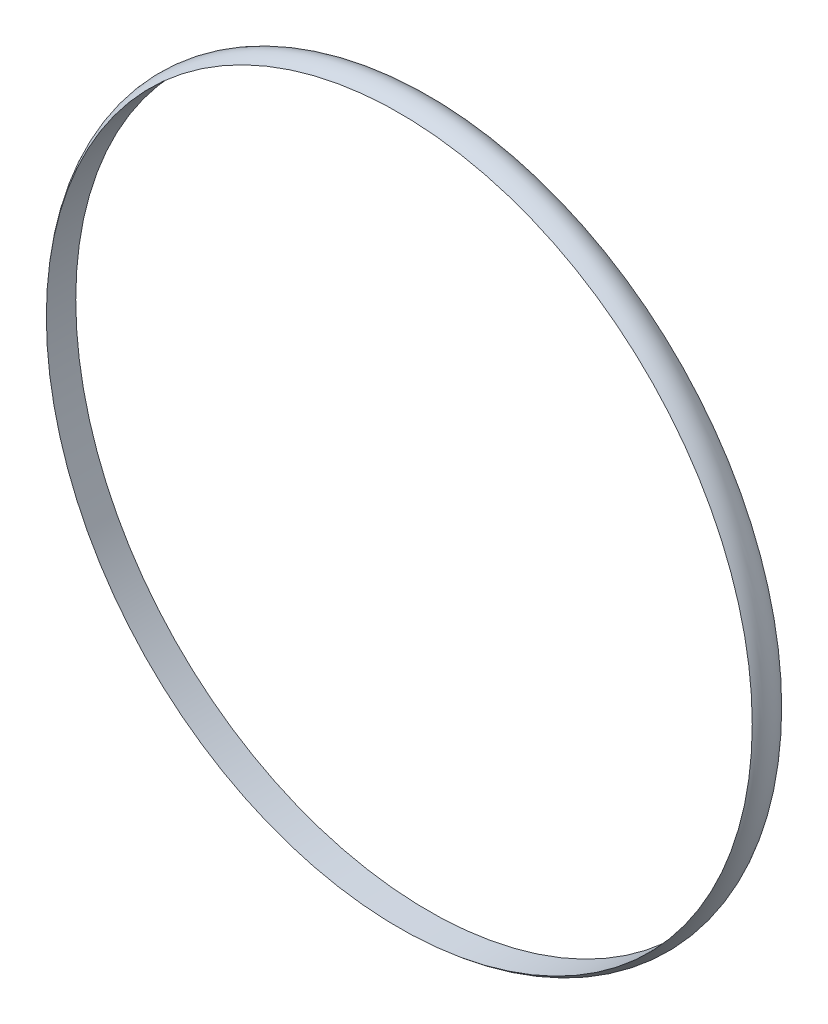
ISO-10303-21;
HEADER;
FILE_DESCRIPTION(('STEP AP214'),'2;1');
FILE_NAME('part.step','',(''),(''),'','','');
FILE_SCHEMA(('AUTOMOTIVE_DESIGN { 1 0 10303 214 1 1 1 1 }'));
ENDSEC;
DATA;
#1=APPLICATION_CONTEXT('core data for automotive mechanical design processes');
#2=APPLICATION_PROTOCOL_DEFINITION('international standard','automotive_design',2000,#1);
#3=PRODUCT_CONTEXT('',#1,'mechanical');
#4=PRODUCT('Part','Part','',(#3));
#5=PRODUCT_RELATED_PRODUCT_CATEGORY('part','',(#4));
#6=PRODUCT_DEFINITION_FORMATION('','',#4);
#7=PRODUCT_DEFINITION_CONTEXT('part definition',#1,'design');
#8=PRODUCT_DEFINITION('design','',#6,#7);
#9=PRODUCT_DEFINITION_SHAPE('','',#8);
#10=(LENGTH_UNIT() NAMED_UNIT(*) SI_UNIT(.MILLI.,.METRE.));
#11=(NAMED_UNIT(*) PLANE_ANGLE_UNIT() SI_UNIT($,.RADIAN.));
#12=(NAMED_UNIT(*) SI_UNIT($,.STERADIAN.) SOLID_ANGLE_UNIT());
#13=UNCERTAINTY_MEASURE_WITH_UNIT(LENGTH_MEASURE(1.E-05),#10,'distance_accuracy_value','');
#14=(GEOMETRIC_REPRESENTATION_CONTEXT(3) GLOBAL_UNCERTAINTY_ASSIGNED_CONTEXT((#13)) GLOBAL_UNIT_ASSIGNED_CONTEXT((#10,
#11,#12)) REPRESENTATION_CONTEXT('',''));
#15=CARTESIAN_POINT('',(0.,0.,0.));
#16=DIRECTION('',(0.,0.,1.));
#17=DIRECTION('',(1.,0.,0.));
#18=AXIS2_PLACEMENT_3D('',#15,#16,#17);
#19=CARTESIAN_POINT('',(0.,0.,0.));
#20=DIRECTION('',(0.,0.,1.));
#21=DIRECTION('',(1.,0.,0.));
#22=AXIS2_PLACEMENT_3D('',#19,#20,#21);
#23=TOROIDAL_SURFACE('',#22,110.31999999999,6.85930025586415);
#24=CARTESIAN_POINT('',(0.,0.,-4.8));
#25=DIRECTION('',(0.,0.,1.));
#26=DIRECTION('',(1.,0.,0.));
#27=AXIS2_PLACEMENT_3D('',#24,#25,#26);
#28=CIRCLE('',#27,115.22);
#29=CARTESIAN_POINT('',(115.22,0.,-4.8));
#30=VERTEX_POINT('',#29);
#31=EDGE_CURVE('E39',#30,#30,#28,.T.);
#32=ORIENTED_EDGE('',*,*,#31,.T.);
#33=EDGE_LOOP('',(#32));
#34=FACE_BOUND('',#33,.T.);
#35=CARTESIAN_POINT('',(0.,0.,4.8));
#36=DIRECTION('',(0.,0.,1.));
#37=DIRECTION('',(1.,0.,0.));
#38=AXIS2_PLACEMENT_3D('',#35,#36,#37);
#39=CIRCLE('',#38,115.22);
#40=CARTESIAN_POINT('',(115.22,0.,4.8));
#41=VERTEX_POINT('',#40);
#42=EDGE_CURVE('E10',#41,#41,#39,.T.);
#43=ORIENTED_EDGE('',*,*,#42,.F.);
#44=EDGE_LOOP('',(#43));
#45=FACE_BOUND('',#44,.T.);
#46=ADVANCED_FACE('F33',(#34,#45),#23,.T.);
#47=CARTESIAN_POINT('',(0.,0.,12.444377479099));
#48=DIRECTION('',(0.,0.,1.));
#49=DIRECTION('',(1.,0.,0.));
#50=AXIS2_PLACEMENT_3D('',#47,#48,#49);
#51=CYLINDRICAL_SURFACE('',#50,115.22);
#52=ORIENTED_EDGE('',*,*,#31,.F.);
#53=EDGE_LOOP('',(#52));
#54=FACE_BOUND('',#53,.T.);
#55=ORIENTED_EDGE('',*,*,#42,.T.);
#56=EDGE_LOOP('',(#55));
#57=FACE_BOUND('',#56,.T.);
#58=ADVANCED_FACE('F47',(#54,#57),#51,.F.);
#59=CLOSED_SHELL('',(#46,#58));
#60=MANIFOLD_SOLID_BREP('B2',#59);
#61=ADVANCED_BREP_SHAPE_REPRESENTATION('',(#18,#60),#14);
#62=SHAPE_DEFINITION_REPRESENTATION(#9,#61);
ENDSEC;
END-ISO-10303-21;
